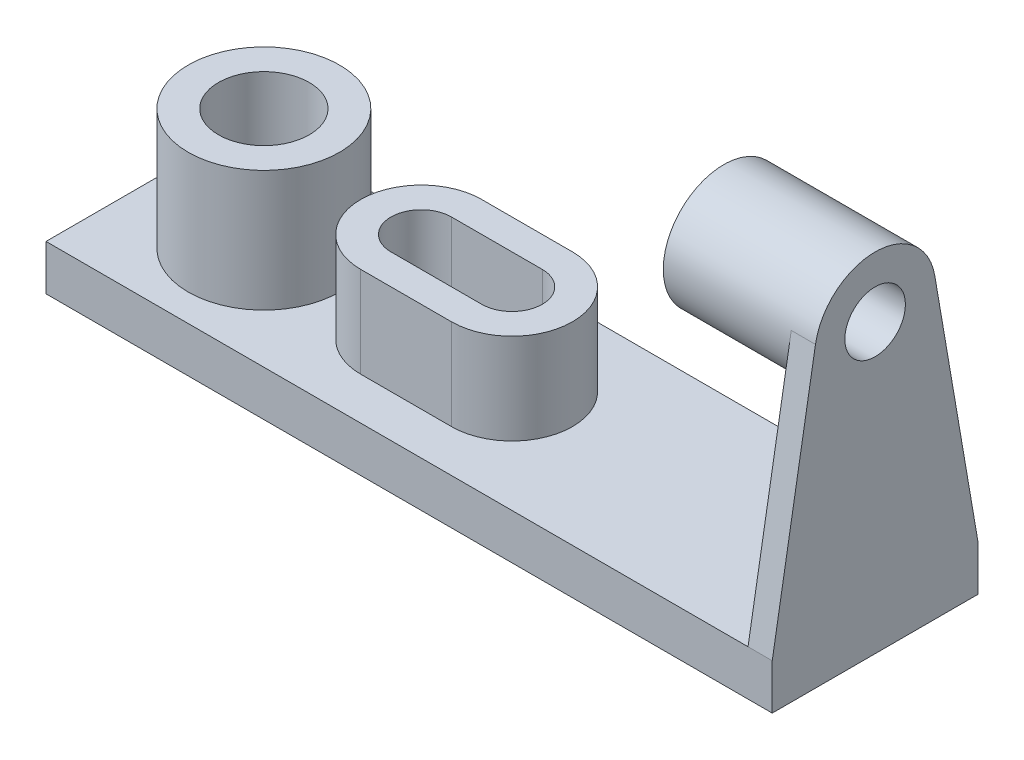
ISO-10303-21;
HEADER;
FILE_DESCRIPTION(('STEP AP214'),'2;1');
FILE_NAME('part.step','',(''),(''),'','','');
FILE_SCHEMA(('AUTOMOTIVE_DESIGN { 1 0 10303 214 1 1 1 1 }'));
ENDSEC;
DATA;
#1=APPLICATION_CONTEXT('core data for automotive mechanical design processes');
#2=APPLICATION_PROTOCOL_DEFINITION('international standard','automotive_design',2000,#1);
#3=PRODUCT_CONTEXT('',#1,'mechanical');
#4=PRODUCT('Part','Part','',(#3));
#5=PRODUCT_RELATED_PRODUCT_CATEGORY('part','',(#4));
#6=PRODUCT_DEFINITION_FORMATION('','',#4);
#7=PRODUCT_DEFINITION_CONTEXT('part definition',#1,'design');
#8=PRODUCT_DEFINITION('design','',#6,#7);
#9=PRODUCT_DEFINITION_SHAPE('','',#8);
#10=(LENGTH_UNIT() NAMED_UNIT(*) SI_UNIT(.MILLI.,.METRE.));
#11=(NAMED_UNIT(*) PLANE_ANGLE_UNIT() SI_UNIT($,.RADIAN.));
#12=(NAMED_UNIT(*) SI_UNIT($,.STERADIAN.) SOLID_ANGLE_UNIT());
#13=UNCERTAINTY_MEASURE_WITH_UNIT(LENGTH_MEASURE(1.E-05),#10,'distance_accuracy_value','');
#14=(GEOMETRIC_REPRESENTATION_CONTEXT(3) GLOBAL_UNCERTAINTY_ASSIGNED_CONTEXT((#13)) GLOBAL_UNIT_ASSIGNED_CONTEXT((#10,
#11,#12)) REPRESENTATION_CONTEXT('',''));
#15=CARTESIAN_POINT('',(0.,0.,0.));
#16=DIRECTION('',(0.,0.,1.));
#17=DIRECTION('',(1.,0.,0.));
#18=AXIS2_PLACEMENT_3D('',#15,#16,#17);
#19=CARTESIAN_POINT('',(-82.,40.,0.));
#20=DIRECTION('',(0.,-1.,0.));
#21=DIRECTION('',(0.,0.,-1.));
#22=AXIS2_PLACEMENT_3D('',#19,#20,#21);
#23=CYLINDRICAL_SURFACE('',#22,25.);
#24=CARTESIAN_POINT('',(-82.,40.,0.));
#25=DIRECTION('',(0.,1.,0.));
#26=DIRECTION('',(0.,0.,1.));
#27=AXIS2_PLACEMENT_3D('',#24,#25,#26);
#28=CIRCLE('',#27,25.);
#29=CARTESIAN_POINT('',(-82.,40.,25.));
#30=VERTEX_POINT('',#29);
#31=EDGE_CURVE('E11',#30,#30,#28,.T.);
#32=ORIENTED_EDGE('',*,*,#31,.F.);
#33=EDGE_LOOP('',(#32));
#34=FACE_BOUND('',#33,.T.);
#35=CARTESIAN_POINT('',(-82.,0.,0.));
#36=DIRECTION('',(0.,1.,0.));
#37=DIRECTION('',(0.,0.,1.));
#38=AXIS2_PLACEMENT_3D('',#35,#36,#37);
#39=CIRCLE('',#38,25.);
#40=CARTESIAN_POINT('',(-82.,0.,25.));
#41=VERTEX_POINT('',#40);
#42=EDGE_CURVE('E56',#41,#41,#39,.T.);
#43=ORIENTED_EDGE('',*,*,#42,.T.);
#44=EDGE_LOOP('',(#43));
#45=FACE_BOUND('',#44,.T.);
#46=ADVANCED_FACE('F53',(#34,#45),#23,.T.);
#47=CARTESIAN_POINT('',(-82.,40.,0.));
#48=DIRECTION('',(0.,1.,0.));
#49=DIRECTION('',(0.,0.,1.));
#50=AXIS2_PLACEMENT_3D('',#47,#48,#49);
#51=PLANE('',#50);
#52=CARTESIAN_POINT('',(-82.,40.,0.));
#53=DIRECTION('',(0.,1.,0.));
#54=DIRECTION('',(0.,0.,1.));
#55=AXIS2_PLACEMENT_3D('',#52,#53,#54);
#56=CIRCLE('',#55,15.);
#57=CARTESIAN_POINT('',(-82.,40.,15.));
#58=VERTEX_POINT('',#57);
#59=EDGE_CURVE('E63',#58,#58,#56,.F.);
#60=ORIENTED_EDGE('',*,*,#59,.T.);
#61=EDGE_LOOP('',(#60));
#62=FACE_BOUND('',#61,.T.);
#63=ORIENTED_EDGE('',*,*,#31,.T.);
#64=EDGE_LOOP('',(#63));
#65=FACE_BOUND('',#64,.T.);
#66=ADVANCED_FACE('F81',(#62,#65),#51,.T.);
#67=CARTESIAN_POINT('',(-82.,0.,0.));
#68=DIRECTION('',(0.,1.,0.));
#69=DIRECTION('',(0.,0.,1.));
#70=AXIS2_PLACEMENT_3D('',#67,#68,#69);
#71=PLANE('',#70);
#72=CARTESIAN_POINT('',(-82.,0.,0.));
#73=DIRECTION('',(0.,1.,0.));
#74=DIRECTION('',(0.,0.,1.));
#75=AXIS2_PLACEMENT_3D('',#72,#73,#74);
#76=CIRCLE('',#75,15.);
#77=CARTESIAN_POINT('',(-82.,0.,15.));
#78=VERTEX_POINT('',#77);
#79=EDGE_CURVE('E67',#78,#78,#76,.T.);
#80=ORIENTED_EDGE('',*,*,#79,.T.);
#81=EDGE_LOOP('',(#80));
#82=FACE_BOUND('',#81,.T.);
#83=ORIENTED_EDGE('',*,*,#42,.F.);
#84=EDGE_LOOP('',(#83));
#85=FACE_BOUND('',#84,.T.);
#86=ADVANCED_FACE('F71',(#82,#85),#71,.F.);
#87=CARTESIAN_POINT('',(-82.,52.,0.));
#88=DIRECTION('',(0.,-1.,0.));
#89=DIRECTION('',(0.,0.,-1.));
#90=AXIS2_PLACEMENT_3D('',#87,#88,#89);
#91=CYLINDRICAL_SURFACE('',#90,15.);
#92=ORIENTED_EDGE('',*,*,#59,.F.);
#93=EDGE_LOOP('',(#92));
#94=FACE_BOUND('',#93,.T.);
#95=ORIENTED_EDGE('',*,*,#79,.F.);
#96=EDGE_LOOP('',(#95));
#97=FACE_BOUND('',#96,.T.);
#98=ADVANCED_FACE('F74',(#94,#97),#91,.F.);
#99=CLOSED_SHELL('',(#46,#66,#86,#98));
#100=MANIFOLD_SOLID_BREP('B2',#99);
#101=CARTESIAN_POINT('',(112.,80.,0.));
#102=DIRECTION('',(1.,0.,0.));
#103=DIRECTION('',(0.,0.,-1.));
#104=AXIS2_PLACEMENT_3D('',#101,#102,#103);
#105=PLANE('',#104);
#106=CARTESIAN_POINT('',(112.,80.,0.));
#107=DIRECTION('',(-1.,0.,0.));
#108=DIRECTION('',(0.,0.,1.));
#109=AXIS2_PLACEMENT_3D('',#106,#107,#108);
#110=CIRCLE('',#109,20.);
#111=CARTESIAN_POINT('',(112.,83.2278322718956,-19.737808865842));
#112=VERTEX_POINT('',#111);
#113=CARTESIAN_POINT('',(112.,83.3778901366535,19.7126826744789));
#114=VERTEX_POINT('',#113);
#115=EDGE_CURVE('E238',#112,#114,#110,.T.);
#116=ORIENTED_EDGE('',*,*,#115,.F.);
#117=DIRECTION('',(0.,0.98563297618064,0.168901261881888));
#118=VECTOR('',#117,1.);
#119=CARTESIAN_POINT('',(112.,83.2278322718956,-19.737808865842));
#120=LINE('',#119,#118);
#121=CARTESIAN_POINT('',(112.,0.,-34.));
#122=VERTEX_POINT('',#121);
#123=EDGE_CURVE('E246',#122,#112,#120,.T.);
#124=ORIENTED_EDGE('',*,*,#123,.F.);
#125=DIRECTION('',(0.,0.,-1.));
#126=VECTOR('',#125,1.);
#127=CARTESIAN_POINT('',(112.,0.,34.));
#128=LINE('',#127,#126);
#129=CARTESIAN_POINT('',(112.,0.,34.));
#130=VERTEX_POINT('',#129);
#131=EDGE_CURVE('E241',#130,#122,#128,.T.);
#132=ORIENTED_EDGE('',*,*,#131,.F.);
#133=DIRECTION('',(0.,-0.985634133723943,0.168894506832676));
#134=VECTOR('',#133,1.);
#135=CARTESIAN_POINT('',(112.,0.,34.));
#136=LINE('',#135,#134);
#137=EDGE_CURVE('E234',#114,#130,#136,.T.);
#138=ORIENTED_EDGE('',*,*,#137,.F.);
#139=EDGE_LOOP('',(#116,#124,#132,#138));
#140=FACE_BOUND('',#139,.T.);
#141=ADVANCED_FACE('F123',(#140),#105,.F.);
#142=CARTESIAN_POINT('',(0.,0.,0.));
#143=DIRECTION('',(0.,1.,0.));
#144=DIRECTION('',(0.,0.,1.));
#145=AXIS2_PLACEMENT_3D('',#142,#143,#144);
#146=PLANE('',#145);
#147=CARTESIAN_POINT('',(-82.,0.,0.));
#148=DIRECTION('',(0.,1.,0.));
#149=DIRECTION('',(0.,0.,1.));
#150=AXIS2_PLACEMENT_3D('',#147,#148,#149);
#151=CIRCLE('',#150,25.);
#152=CARTESIAN_POINT('',(-82.,0.,25.));
#153=VERTEX_POINT('',#152);
#154=EDGE_CURVE('E375',#153,#153,#151,.T.);
#155=ORIENTED_EDGE('',*,*,#154,.F.);
#156=EDGE_LOOP('',(#155));
#157=FACE_BOUND('',#156,.T.);
#158=DIRECTION('',(1.,0.,0.));
#159=VECTOR('',#158,1.);
#160=CARTESIAN_POINT('',(-30.,0.,20.));
#161=LINE('',#160,#159);
#162=CARTESIAN_POINT('',(-30.,0.,20.));
#163=VERTEX_POINT('',#162);
#164=CARTESIAN_POINT('',(0.,0.,20.));
#165=VERTEX_POINT('',#164);
#166=EDGE_CURVE('E355',#163,#165,#161,.T.);
#167=ORIENTED_EDGE('',*,*,#166,.F.);
#168=CARTESIAN_POINT('',(-30.,0.,0.));
#169=DIRECTION('',(0.,1.,0.));
#170=DIRECTION('',(0.,0.,1.));
#171=AXIS2_PLACEMENT_3D('',#168,#169,#170);
#172=CIRCLE('',#171,20.);
#173=CARTESIAN_POINT('',(-30.,0.,-20.));
#174=VERTEX_POINT('',#173);
#175=EDGE_CURVE('E336',#174,#163,#172,.T.);
#176=ORIENTED_EDGE('',*,*,#175,.F.);
#177=DIRECTION('',(-1.,0.,0.));
#178=VECTOR('',#177,1.);
#179=CARTESIAN_POINT('',(-30.,0.,-20.));
#180=LINE('',#179,#178);
#181=CARTESIAN_POINT('',(0.,0.,-20.));
#182=VERTEX_POINT('',#181);
#183=EDGE_CURVE('E342',#182,#174,#180,.T.);
#184=ORIENTED_EDGE('',*,*,#183,.F.);
#185=CARTESIAN_POINT('',(0.,0.,0.));
#186=DIRECTION('',(0.,1.,0.));
#187=DIRECTION('',(0.,0.,1.));
#188=AXIS2_PLACEMENT_3D('',#185,#186,#187);
#189=CIRCLE('',#188,20.);
#190=EDGE_CURVE('E358',#165,#182,#189,.T.);
#191=ORIENTED_EDGE('',*,*,#190,.F.);
#192=EDGE_LOOP('',(#167,#176,#184,#191));
#193=FACE_BOUND('',#192,.T.);
#194=DIRECTION('',(1.,0.,0.));
#195=VECTOR('',#194,1.);
#196=CARTESIAN_POINT('',(0.,0.,34.));
#197=LINE('',#196,#195);
#198=CARTESIAN_POINT('',(-120.,0.,34.));
#199=VERTEX_POINT('',#198);
#200=EDGE_CURVE('E381',#199,#130,#197,.T.);
#201=ORIENTED_EDGE('',*,*,#200,.T.);
#202=ORIENTED_EDGE('',*,*,#131,.T.);
#203=DIRECTION('',(1.,0.,0.));
#204=VECTOR('',#203,1.);
#205=CARTESIAN_POINT('',(0.,0.,-34.));
#206=LINE('',#205,#204);
#207=CARTESIAN_POINT('',(-120.,0.,-34.));
#208=VERTEX_POINT('',#207);
#209=EDGE_CURVE('E398',#208,#122,#206,.T.);
#210=ORIENTED_EDGE('',*,*,#209,.F.);
#211=DIRECTION('',(0.,0.,1.));
#212=VECTOR('',#211,1.);
#213=CARTESIAN_POINT('',(-120.,0.,0.));
#214=LINE('',#213,#212);
#215=EDGE_CURVE('E402',#208,#199,#214,.T.);
#216=ORIENTED_EDGE('',*,*,#215,.T.);
#217=EDGE_LOOP('',(#201,#202,#210,#216));
#218=FACE_BOUND('',#217,.T.);
#219=ADVANCED_FACE('F428',(#157,#193,#218),#146,.T.);
#220=CARTESIAN_POINT('',(0.,-15.,0.));
#221=DIRECTION('',(0.,1.,0.));
#222=DIRECTION('',(0.,0.,1.));
#223=AXIS2_PLACEMENT_3D('',#220,#221,#222);
#224=PLANE('',#223);
#225=DIRECTION('',(0.,0.,1.));
#226=VECTOR('',#225,1.);
#227=CARTESIAN_POINT('',(120.,-15.,0.));
#228=LINE('',#227,#226);
#229=CARTESIAN_POINT('',(120.,-15.,-34.));
#230=VERTEX_POINT('',#229);
#231=CARTESIAN_POINT('',(120.,-15.,34.));
#232=VERTEX_POINT('',#231);
#233=EDGE_CURVE('E380',#230,#232,#228,.T.);
#234=ORIENTED_EDGE('',*,*,#233,.T.);
#235=DIRECTION('',(1.,0.,0.));
#236=VECTOR('',#235,1.);
#237=CARTESIAN_POINT('',(0.,-15.,34.));
#238=LINE('',#237,#236);
#239=CARTESIAN_POINT('',(-120.,-15.,34.));
#240=VERTEX_POINT('',#239);
#241=EDGE_CURVE('E391',#240,#232,#238,.T.);
#242=ORIENTED_EDGE('',*,*,#241,.F.);
#243=DIRECTION('',(0.,0.,1.));
#244=VECTOR('',#243,1.);
#245=CARTESIAN_POINT('',(-120.,-15.,0.));
#246=LINE('',#245,#244);
#247=CARTESIAN_POINT('',(-120.,-15.,-34.));
#248=VERTEX_POINT('',#247);
#249=EDGE_CURVE('E387',#248,#240,#246,.T.);
#250=ORIENTED_EDGE('',*,*,#249,.F.);
#251=DIRECTION('',(1.,0.,0.));
#252=VECTOR('',#251,1.);
#253=CARTESIAN_POINT('',(0.,-15.,-34.));
#254=LINE('',#253,#252);
#255=EDGE_CURVE('E384',#248,#230,#254,.T.);
#256=ORIENTED_EDGE('',*,*,#255,.T.);
#257=EDGE_LOOP('',(#234,#242,#250,#256));
#258=FACE_BOUND('',#257,.T.);
#259=CARTESIAN_POINT('',(-82.,-15.,0.));
#260=DIRECTION('',(0.,1.,0.));
#261=DIRECTION('',(0.,0.,1.));
#262=AXIS2_PLACEMENT_3D('',#259,#260,#261);
#263=CIRCLE('',#262,25.);
#264=CARTESIAN_POINT('',(-82.,-15.,25.));
#265=VERTEX_POINT('',#264);
#266=EDGE_CURVE('E376',#265,#265,#263,.T.);
#267=ORIENTED_EDGE('',*,*,#266,.T.);
#268=EDGE_LOOP('',(#267));
#269=FACE_BOUND('',#268,.T.);
#270=CARTESIAN_POINT('',(-30.,-15.,0.));
#271=DIRECTION('',(0.,1.,0.));
#272=DIRECTION('',(0.,0.,1.));
#273=AXIS2_PLACEMENT_3D('',#270,#271,#272);
#274=CIRCLE('',#273,10.);
#275=CARTESIAN_POINT('',(-30.,-15.,10.));
#276=VERTEX_POINT('',#275);
#277=CARTESIAN_POINT('',(-30.,-15.,-10.));
#278=VERTEX_POINT('',#277);
#279=EDGE_CURVE('E309',#276,#278,#274,.F.);
#280=ORIENTED_EDGE('',*,*,#279,.F.);
#281=DIRECTION('',(-1.,0.,0.));
#282=VECTOR('',#281,1.);
#283=CARTESIAN_POINT('',(0.,-15.,10.));
#284=LINE('',#283,#282);
#285=CARTESIAN_POINT('',(0.,-15.,10.));
#286=VERTEX_POINT('',#285);
#287=EDGE_CURVE('E305',#286,#276,#284,.T.);
#288=ORIENTED_EDGE('',*,*,#287,.F.);
#289=CARTESIAN_POINT('',(0.,-15.,0.));
#290=DIRECTION('',(0.,1.,0.));
#291=DIRECTION('',(0.,0.,1.));
#292=AXIS2_PLACEMENT_3D('',#289,#290,#291);
#293=CIRCLE('',#292,10.);
#294=CARTESIAN_POINT('',(0.,-15.,-10.));
#295=VERTEX_POINT('',#294);
#296=EDGE_CURVE('E301',#295,#286,#293,.F.);
#297=ORIENTED_EDGE('',*,*,#296,.F.);
#298=DIRECTION('',(1.,0.,0.));
#299=VECTOR('',#298,1.);
#300=CARTESIAN_POINT('',(0.,-15.,-10.));
#301=LINE('',#300,#299);
#302=EDGE_CURVE('E292',#278,#295,#301,.T.);
#303=ORIENTED_EDGE('',*,*,#302,.F.);
#304=EDGE_LOOP('',(#280,#288,#297,#303));
#305=FACE_BOUND('',#304,.T.);
#306=ADVANCED_FACE('F435',(#258,#269,#305),#224,.F.);
#307=CARTESIAN_POINT('',(120.,-15.,0.));
#308=DIRECTION('',(-1.,0.,0.));
#309=DIRECTION('',(0.,0.,1.));
#310=AXIS2_PLACEMENT_3D('',#307,#308,#309);
#311=PLANE('',#310);
#312=DIRECTION('',(0.,1.,0.));
#313=VECTOR('',#312,1.);
#314=CARTESIAN_POINT('',(120.,-15.,-34.));
#315=LINE('',#314,#313);
#316=CARTESIAN_POINT('',(120.,0.,-34.));
#317=VERTEX_POINT('',#316);
#318=EDGE_CURVE('E127',#230,#317,#315,.T.);
#319=ORIENTED_EDGE('',*,*,#318,.T.);
#320=DIRECTION('',(0.,0.98563297618064,0.168901261881888));
#321=VECTOR('',#320,1.);
#322=CARTESIAN_POINT('',(120.,83.2278322718956,-19.737808865842));
#323=LINE('',#322,#321);
#324=CARTESIAN_POINT('',(120.,83.2278322718956,-19.737808865842));
#325=VERTEX_POINT('',#324);
#326=EDGE_CURVE('E278',#317,#325,#323,.T.);
#327=ORIENTED_EDGE('',*,*,#326,.T.);
#328=CARTESIAN_POINT('',(120.,80.,0.));
#329=DIRECTION('',(1.,0.,0.));
#330=DIRECTION('',(0.,0.,-1.));
#331=AXIS2_PLACEMENT_3D('',#328,#329,#330);
#332=CIRCLE('',#331,20.);
#333=CARTESIAN_POINT('',(120.,83.3778901366535,19.7126826744789));
#334=VERTEX_POINT('',#333);
#335=EDGE_CURVE('E286',#325,#334,#332,.T.);
#336=ORIENTED_EDGE('',*,*,#335,.T.);
#337=DIRECTION('',(0.,-0.985634133723943,0.168894506832676));
#338=VECTOR('',#337,1.);
#339=CARTESIAN_POINT('',(120.,0.,34.));
#340=LINE('',#339,#338);
#341=CARTESIAN_POINT('',(120.,0.,34.));
#342=VERTEX_POINT('',#341);
#343=EDGE_CURVE('E252',#334,#342,#340,.T.);
#344=ORIENTED_EDGE('',*,*,#343,.T.);
#345=DIRECTION('',(0.,1.,0.));
#346=VECTOR('',#345,1.);
#347=CARTESIAN_POINT('',(120.,-15.,34.));
#348=LINE('',#347,#346);
#349=EDGE_CURVE('E51',#232,#342,#348,.T.);
#350=ORIENTED_EDGE('',*,*,#349,.F.);
#351=ORIENTED_EDGE('',*,*,#233,.F.);
#352=EDGE_LOOP('',(#319,#327,#336,#344,#350,#351));
#353=FACE_BOUND('',#352,.T.);
#354=CARTESIAN_POINT('',(120.,80.,0.));
#355=DIRECTION('',(1.,0.,0.));
#356=DIRECTION('',(0.,0.,-1.));
#357=AXIS2_PLACEMENT_3D('',#354,#355,#356);
#358=CIRCLE('',#357,10.);
#359=CARTESIAN_POINT('',(120.,80.,-10.));
#360=VERTEX_POINT('',#359);
#361=EDGE_CURVE('E270',#360,#360,#358,.T.);
#362=ORIENTED_EDGE('',*,*,#361,.F.);
#363=EDGE_LOOP('',(#362));
#364=FACE_BOUND('',#363,.T.);
#365=ADVANCED_FACE('F420',(#353,#364),#311,.F.);
#366=CARTESIAN_POINT('',(0.,-15.,34.));
#367=DIRECTION('',(0.,0.,1.));
#368=DIRECTION('',(1.,0.,0.));
#369=AXIS2_PLACEMENT_3D('',#366,#367,#368);
#370=PLANE('',#369);
#371=ORIENTED_EDGE('',*,*,#200,.F.);
#372=DIRECTION('',(0.,1.,0.));
#373=VECTOR('',#372,1.);
#374=CARTESIAN_POINT('',(-120.,-15.,34.));
#375=LINE('',#374,#373);
#376=EDGE_CURVE('E133',#240,#199,#375,.T.);
#377=ORIENTED_EDGE('',*,*,#376,.F.);
#378=ORIENTED_EDGE('',*,*,#241,.T.);
#379=ORIENTED_EDGE('',*,*,#349,.T.);
#380=DIRECTION('',(1.,0.,0.));
#381=VECTOR('',#380,1.);
#382=CARTESIAN_POINT('',(112.,0.,34.));
#383=LINE('',#382,#381);
#384=EDGE_CURVE('E257',#130,#342,#383,.T.);
#385=ORIENTED_EDGE('',*,*,#384,.F.);
#386=EDGE_LOOP('',(#371,#377,#378,#379,#385));
#387=FACE_BOUND('',#386,.T.);
#388=ADVANCED_FACE('F432',(#387),#370,.T.);
#389=CARTESIAN_POINT('',(-120.,-15.,0.));
#390=DIRECTION('',(-1.,0.,0.));
#391=DIRECTION('',(0.,0.,1.));
#392=AXIS2_PLACEMENT_3D('',#389,#390,#391);
#393=PLANE('',#392);
#394=ORIENTED_EDGE('',*,*,#215,.F.);
#395=DIRECTION('',(0.,1.,0.));
#396=VECTOR('',#395,1.);
#397=CARTESIAN_POINT('',(-120.,-15.,-34.));
#398=LINE('',#397,#396);
#399=EDGE_CURVE('E410',#248,#208,#398,.T.);
#400=ORIENTED_EDGE('',*,*,#399,.F.);
#401=ORIENTED_EDGE('',*,*,#249,.T.);
#402=ORIENTED_EDGE('',*,*,#376,.T.);
#403=EDGE_LOOP('',(#394,#400,#401,#402));
#404=FACE_BOUND('',#403,.T.);
#405=ADVANCED_FACE('F438',(#404),#393,.T.);
#406=CARTESIAN_POINT('',(-82.,-15.,0.));
#407=DIRECTION('',(0.,1.,0.));
#408=DIRECTION('',(0.,0.,1.));
#409=AXIS2_PLACEMENT_3D('',#406,#407,#408);
#410=CYLINDRICAL_SURFACE('',#409,25.);
#411=ORIENTED_EDGE('',*,*,#266,.F.);
#412=EDGE_LOOP('',(#411));
#413=FACE_BOUND('',#412,.T.);
#414=ORIENTED_EDGE('',*,*,#154,.T.);
#415=EDGE_LOOP('',(#414));
#416=FACE_BOUND('',#415,.T.);
#417=ADVANCED_FACE('F125',(#413,#416),#410,.F.);
#418=CARTESIAN_POINT('',(0.,-15.,-34.));
#419=DIRECTION('',(0.,0.,1.));
#420=DIRECTION('',(1.,0.,0.));
#421=AXIS2_PLACEMENT_3D('',#418,#419,#420);
#422=PLANE('',#421);
#423=ORIENTED_EDGE('',*,*,#209,.T.);
#424=DIRECTION('',(1.,0.,0.));
#425=VECTOR('',#424,1.);
#426=CARTESIAN_POINT('',(112.,0.,-34.));
#427=LINE('',#426,#425);
#428=EDGE_CURVE('E245',#122,#317,#427,.T.);
#429=ORIENTED_EDGE('',*,*,#428,.T.);
#430=ORIENTED_EDGE('',*,*,#318,.F.);
#431=ORIENTED_EDGE('',*,*,#255,.F.);
#432=ORIENTED_EDGE('',*,*,#399,.T.);
#433=EDGE_LOOP('',(#423,#429,#430,#431,#432));
#434=FACE_BOUND('',#433,.T.);
#435=ADVANCED_FACE('F423',(#434),#422,.F.);
#436=CARTESIAN_POINT('',(-30.,30.,0.));
#437=DIRECTION('',(0.,1.,0.));
#438=DIRECTION('',(0.,0.,1.));
#439=AXIS2_PLACEMENT_3D('',#436,#437,#438);
#440=PLANE('',#439);
#441=CARTESIAN_POINT('',(-30.,30.,0.));
#442=DIRECTION('',(0.,1.,0.));
#443=DIRECTION('',(0.,0.,1.));
#444=AXIS2_PLACEMENT_3D('',#441,#442,#443);
#445=CIRCLE('',#444,20.);
#446=CARTESIAN_POINT('',(-30.,30.,-20.));
#447=VERTEX_POINT('',#446);
#448=CARTESIAN_POINT('',(-30.,30.,20.));
#449=VERTEX_POINT('',#448);
#450=EDGE_CURVE('E337',#447,#449,#445,.T.);
#451=ORIENTED_EDGE('',*,*,#450,.T.);
#452=DIRECTION('',(1.,0.,0.));
#453=VECTOR('',#452,1.);
#454=CARTESIAN_POINT('',(-30.,30.,20.));
#455=LINE('',#454,#453);
#456=CARTESIAN_POINT('',(0.,30.,20.));
#457=VERTEX_POINT('',#456);
#458=EDGE_CURVE('E341',#449,#457,#455,.T.);
#459=ORIENTED_EDGE('',*,*,#458,.T.);
#460=CARTESIAN_POINT('',(0.,30.,0.));
#461=DIRECTION('',(0.,1.,0.));
#462=DIRECTION('',(0.,0.,1.));
#463=AXIS2_PLACEMENT_3D('',#460,#461,#462);
#464=CIRCLE('',#463,20.);
#465=CARTESIAN_POINT('',(0.,30.,-20.));
#466=VERTEX_POINT('',#465);
#467=EDGE_CURVE('E345',#457,#466,#464,.T.);
#468=ORIENTED_EDGE('',*,*,#467,.T.);
#469=DIRECTION('',(-1.,0.,0.));
#470=VECTOR('',#469,1.);
#471=CARTESIAN_POINT('',(-30.,30.,-20.));
#472=LINE('',#471,#470);
#473=EDGE_CURVE('E348',#466,#447,#472,.T.);
#474=ORIENTED_EDGE('',*,*,#473,.T.);
#475=EDGE_LOOP('',(#451,#459,#468,#474));
#476=FACE_BOUND('',#475,.T.);
#477=DIRECTION('',(1.,0.,0.));
#478=VECTOR('',#477,1.);
#479=CARTESIAN_POINT('',(-30.,30.,10.));
#480=LINE('',#479,#478);
#481=CARTESIAN_POINT('',(-30.,30.,10.));
#482=VERTEX_POINT('',#481);
#483=CARTESIAN_POINT('',(0.,30.,10.));
#484=VERTEX_POINT('',#483);
#485=EDGE_CURVE('E315',#482,#484,#480,.T.);
#486=ORIENTED_EDGE('',*,*,#485,.F.);
#487=CARTESIAN_POINT('',(-30.,30.,0.));
#488=DIRECTION('',(0.,1.,0.));
#489=DIRECTION('',(0.,0.,1.));
#490=AXIS2_PLACEMENT_3D('',#487,#488,#489);
#491=CIRCLE('',#490,10.);
#492=CARTESIAN_POINT('',(-30.,30.,-10.));
#493=VERTEX_POINT('',#492);
#494=EDGE_CURVE('E312',#493,#482,#491,.T.);
#495=ORIENTED_EDGE('',*,*,#494,.F.);
#496=DIRECTION('',(-1.,0.,0.));
#497=VECTOR('',#496,1.);
#498=CARTESIAN_POINT('',(-30.,30.,-10.));
#499=LINE('',#498,#497);
#500=CARTESIAN_POINT('',(0.,30.,-10.));
#501=VERTEX_POINT('',#500);
#502=EDGE_CURVE('E322',#501,#493,#499,.T.);
#503=ORIENTED_EDGE('',*,*,#502,.F.);
#504=CARTESIAN_POINT('',(0.,30.,0.));
#505=DIRECTION('',(0.,1.,0.));
#506=DIRECTION('',(0.,0.,1.));
#507=AXIS2_PLACEMENT_3D('',#504,#505,#506);
#508=CIRCLE('',#507,10.);
#509=EDGE_CURVE('E318',#484,#501,#508,.T.);
#510=ORIENTED_EDGE('',*,*,#509,.F.);
#511=EDGE_LOOP('',(#486,#495,#503,#510));
#512=FACE_BOUND('',#511,.T.);
#513=ADVANCED_FACE('F481',(#476,#512),#440,.T.);
#514=CARTESIAN_POINT('',(-30.,30.,0.));
#515=DIRECTION('',(0.,-1.,0.));
#516=DIRECTION('',(0.,0.,-1.));
#517=AXIS2_PLACEMENT_3D('',#514,#515,#516);
#518=CYLINDRICAL_SURFACE('',#517,20.);
#519=ORIENTED_EDGE('',*,*,#175,.T.);
#520=DIRECTION('',(0.,-1.,0.));
#521=VECTOR('',#520,1.);
#522=CARTESIAN_POINT('',(-30.,30.,20.));
#523=LINE('',#522,#521);
#524=EDGE_CURVE('E372',#449,#163,#523,.T.);
#525=ORIENTED_EDGE('',*,*,#524,.F.);
#526=ORIENTED_EDGE('',*,*,#450,.F.);
#527=DIRECTION('',(0.,-1.,0.));
#528=VECTOR('',#527,1.);
#529=CARTESIAN_POINT('',(-30.,30.,-20.));
#530=LINE('',#529,#528);
#531=EDGE_CURVE('E351',#447,#174,#530,.T.);
#532=ORIENTED_EDGE('',*,*,#531,.T.);
#533=EDGE_LOOP('',(#519,#525,#526,#532));
#534=FACE_BOUND('',#533,.T.);
#535=ADVANCED_FACE('F484',(#534),#518,.T.);
#536=CARTESIAN_POINT('',(-30.,30.,20.));
#537=DIRECTION('',(0.,0.,-1.));
#538=DIRECTION('',(-1.,0.,0.));
#539=AXIS2_PLACEMENT_3D('',#536,#537,#538);
#540=PLANE('',#539);
#541=ORIENTED_EDGE('',*,*,#166,.T.);
#542=DIRECTION('',(0.,-1.,0.));
#543=VECTOR('',#542,1.);
#544=CARTESIAN_POINT('',(0.,30.,20.));
#545=LINE('',#544,#543);
#546=EDGE_CURVE('E368',#457,#165,#545,.T.);
#547=ORIENTED_EDGE('',*,*,#546,.F.);
#548=ORIENTED_EDGE('',*,*,#458,.F.);
#549=ORIENTED_EDGE('',*,*,#524,.T.);
#550=EDGE_LOOP('',(#541,#547,#548,#549));
#551=FACE_BOUND('',#550,.T.);
#552=ADVANCED_FACE('F491',(#551),#540,.F.);
#553=CARTESIAN_POINT('',(0.,30.,0.));
#554=DIRECTION('',(0.,-1.,0.));
#555=DIRECTION('',(0.,0.,-1.));
#556=AXIS2_PLACEMENT_3D('',#553,#554,#555);
#557=CYLINDRICAL_SURFACE('',#556,20.);
#558=ORIENTED_EDGE('',*,*,#190,.T.);
#559=DIRECTION('',(0.,-1.,0.));
#560=VECTOR('',#559,1.);
#561=CARTESIAN_POINT('',(0.,30.,-20.));
#562=LINE('',#561,#560);
#563=EDGE_CURVE('E149',#466,#182,#562,.T.);
#564=ORIENTED_EDGE('',*,*,#563,.F.);
#565=ORIENTED_EDGE('',*,*,#467,.F.);
#566=ORIENTED_EDGE('',*,*,#546,.T.);
#567=EDGE_LOOP('',(#558,#564,#565,#566));
#568=FACE_BOUND('',#567,.T.);
#569=ADVANCED_FACE('F488',(#568),#557,.T.);
#570=CARTESIAN_POINT('',(-30.,30.,-20.));
#571=DIRECTION('',(0.,0.,1.));
#572=DIRECTION('',(1.,0.,0.));
#573=AXIS2_PLACEMENT_3D('',#570,#571,#572);
#574=PLANE('',#573);
#575=ORIENTED_EDGE('',*,*,#183,.T.);
#576=ORIENTED_EDGE('',*,*,#531,.F.);
#577=ORIENTED_EDGE('',*,*,#473,.F.);
#578=ORIENTED_EDGE('',*,*,#563,.T.);
#579=EDGE_LOOP('',(#575,#576,#577,#578));
#580=FACE_BOUND('',#579,.T.);
#581=ADVANCED_FACE('F479',(#580),#574,.F.);
#582=CARTESIAN_POINT('',(-30.,30.,0.));
#583=DIRECTION('',(0.,-1.,0.));
#584=DIRECTION('',(0.,0.,-1.));
#585=AXIS2_PLACEMENT_3D('',#582,#583,#584);
#586=CYLINDRICAL_SURFACE('',#585,10.);
#587=DIRECTION('',(0.,-1.,0.));
#588=VECTOR('',#587,1.);
#589=CARTESIAN_POINT('',(-30.,30.,10.));
#590=LINE('',#589,#588);
#591=EDGE_CURVE('E333',#482,#276,#590,.T.);
#592=ORIENTED_EDGE('',*,*,#591,.T.);
#593=ORIENTED_EDGE('',*,*,#279,.T.);
#594=DIRECTION('',(0.,-1.,0.));
#595=VECTOR('',#594,1.);
#596=CARTESIAN_POINT('',(-30.,30.,-10.));
#597=LINE('',#596,#595);
#598=EDGE_CURVE('E141',#493,#278,#597,.T.);
#599=ORIENTED_EDGE('',*,*,#598,.F.);
#600=ORIENTED_EDGE('',*,*,#494,.T.);
#601=EDGE_LOOP('',(#592,#593,#599,#600));
#602=FACE_BOUND('',#601,.T.);
#603=ADVANCED_FACE('F475',(#602),#586,.F.);
#604=CARTESIAN_POINT('',(-30.,30.,10.));
#605=DIRECTION('',(0.,0.,-1.));
#606=DIRECTION('',(-1.,0.,0.));
#607=AXIS2_PLACEMENT_3D('',#604,#605,#606);
#608=PLANE('',#607);
#609=DIRECTION('',(0.,-1.,0.));
#610=VECTOR('',#609,1.);
#611=CARTESIAN_POINT('',(0.,30.,10.));
#612=LINE('',#611,#610);
#613=EDGE_CURVE('E330',#484,#286,#612,.T.);
#614=ORIENTED_EDGE('',*,*,#613,.T.);
#615=ORIENTED_EDGE('',*,*,#287,.T.);
#616=ORIENTED_EDGE('',*,*,#591,.F.);
#617=ORIENTED_EDGE('',*,*,#485,.T.);
#618=EDGE_LOOP('',(#614,#615,#616,#617));
#619=FACE_BOUND('',#618,.T.);
#620=ADVANCED_FACE('F471',(#619),#608,.T.);
#621=CARTESIAN_POINT('',(0.,30.,0.));
#622=DIRECTION('',(0.,-1.,0.));
#623=DIRECTION('',(0.,0.,-1.));
#624=AXIS2_PLACEMENT_3D('',#621,#622,#623);
#625=CYLINDRICAL_SURFACE('',#624,10.);
#626=DIRECTION('',(0.,-1.,0.));
#627=VECTOR('',#626,1.);
#628=CARTESIAN_POINT('',(0.,30.,-10.));
#629=LINE('',#628,#627);
#630=EDGE_CURVE('E327',#501,#295,#629,.T.);
#631=ORIENTED_EDGE('',*,*,#630,.T.);
#632=ORIENTED_EDGE('',*,*,#296,.T.);
#633=ORIENTED_EDGE('',*,*,#613,.F.);
#634=ORIENTED_EDGE('',*,*,#509,.T.);
#635=EDGE_LOOP('',(#631,#632,#633,#634));
#636=FACE_BOUND('',#635,.T.);
#637=ADVANCED_FACE('F468',(#636),#625,.F.);
#638=CARTESIAN_POINT('',(-30.,30.,-10.));
#639=DIRECTION('',(0.,0.,1.));
#640=DIRECTION('',(1.,0.,0.));
#641=AXIS2_PLACEMENT_3D('',#638,#639,#640);
#642=PLANE('',#641);
#643=ORIENTED_EDGE('',*,*,#598,.T.);
#644=ORIENTED_EDGE('',*,*,#302,.T.);
#645=ORIENTED_EDGE('',*,*,#630,.F.);
#646=ORIENTED_EDGE('',*,*,#502,.T.);
#647=EDGE_LOOP('',(#643,#644,#645,#646));
#648=FACE_BOUND('',#647,.T.);
#649=ADVANCED_FACE('F461',(#648),#642,.T.);
#650=CARTESIAN_POINT('',(112.,0.,34.));
#651=DIRECTION('',(0.,0.168894506832676,0.985634133723943));
#652=DIRECTION('',(0.,-0.985634133723943,0.168894506832676));
#653=AXIS2_PLACEMENT_3D('',#650,#651,#652);
#654=PLANE('',#653);
#655=ORIENTED_EDGE('',*,*,#343,.F.);
#656=DIRECTION('',(1.,0.,0.));
#657=VECTOR('',#656,1.);
#658=CARTESIAN_POINT('',(112.,83.3778901366535,19.7126826744789));
#659=LINE('',#658,#657);
#660=EDGE_CURVE('E249',#114,#334,#659,.T.);
#661=ORIENTED_EDGE('',*,*,#660,.F.);
#662=ORIENTED_EDGE('',*,*,#137,.T.);
#663=ORIENTED_EDGE('',*,*,#384,.T.);
#664=EDGE_LOOP('',(#655,#661,#662,#663));
#665=FACE_BOUND('',#664,.T.);
#666=ADVANCED_FACE('F250',(#665),#654,.T.);
#667=CARTESIAN_POINT('',(112.,80.,0.));
#668=DIRECTION('',(1.,0.,0.));
#669=DIRECTION('',(0.,0.,-1.));
#670=AXIS2_PLACEMENT_3D('',#667,#668,#669);
#671=CYLINDRICAL_SURFACE('',#670,20.);
#672=ORIENTED_EDGE('',*,*,#335,.F.);
#673=DIRECTION('',(1.,0.,0.));
#674=VECTOR('',#673,1.);
#675=CARTESIAN_POINT('',(112.,83.2278322718956,-19.737808865842));
#676=LINE('',#675,#674);
#677=EDGE_CURVE('E258',#112,#325,#676,.T.);
#678=ORIENTED_EDGE('',*,*,#677,.F.);
#679=ORIENTED_EDGE('',*,*,#115,.T.);
#680=ORIENTED_EDGE('',*,*,#660,.T.);
#681=EDGE_LOOP('',(#672,#678,#679,#680));
#682=FACE_BOUND('',#681,.T.);
#683=CARTESIAN_POINT('',(70.,80.,0.));
#684=DIRECTION('',(-1.,0.,0.));
#685=DIRECTION('',(0.,0.,1.));
#686=AXIS2_PLACEMENT_3D('',#683,#684,#685);
#687=CIRCLE('',#686,20.);
#688=CARTESIAN_POINT('',(70.,80.,20.));
#689=VERTEX_POINT('',#688);
#690=EDGE_CURVE('E264',#689,#689,#687,.T.);
#691=ORIENTED_EDGE('',*,*,#690,.F.);
#692=EDGE_LOOP('',(#691));
#693=FACE_BOUND('',#692,.T.);
#694=ADVANCED_FACE('F260',(#682,#693),#671,.T.);
#695=CARTESIAN_POINT('',(112.,83.2278322718956,-19.737808865842));
#696=DIRECTION('',(0.,0.168901261881889,-0.98563297618064));
#697=DIRECTION('',(0.,0.98563297618064,0.168901261881889));
#698=AXIS2_PLACEMENT_3D('',#695,#696,#697);
#699=PLANE('',#698);
#700=ORIENTED_EDGE('',*,*,#326,.F.);
#701=ORIENTED_EDGE('',*,*,#428,.F.);
#702=ORIENTED_EDGE('',*,*,#123,.T.);
#703=ORIENTED_EDGE('',*,*,#677,.T.);
#704=EDGE_LOOP('',(#700,#701,#702,#703));
#705=FACE_BOUND('',#704,.T.);
#706=ADVANCED_FACE('F426',(#705),#699,.T.);
#707=CARTESIAN_POINT('',(112.,80.,0.));
#708=DIRECTION('',(1.,0.,0.));
#709=DIRECTION('',(0.,0.,-1.));
#710=AXIS2_PLACEMENT_3D('',#707,#708,#709);
#711=CYLINDRICAL_SURFACE('',#710,10.);
#712=ORIENTED_EDGE('',*,*,#361,.T.);
#713=EDGE_LOOP('',(#712));
#714=FACE_BOUND('',#713,.T.);
#715=CARTESIAN_POINT('',(70.,80.,0.));
#716=DIRECTION('',(-1.,0.,0.));
#717=DIRECTION('',(0.,0.,1.));
#718=AXIS2_PLACEMENT_3D('',#715,#716,#717);
#719=CIRCLE('',#718,10.);
#720=CARTESIAN_POINT('',(70.,80.,10.));
#721=VERTEX_POINT('',#720);
#722=EDGE_CURVE('E265',#721,#721,#719,.T.);
#723=ORIENTED_EDGE('',*,*,#722,.T.);
#724=EDGE_LOOP('',(#723));
#725=FACE_BOUND('',#724,.T.);
#726=ADVANCED_FACE('F457',(#714,#725),#711,.F.);
#727=CARTESIAN_POINT('',(70.,80.,0.));
#728=DIRECTION('',(-1.,0.,0.));
#729=DIRECTION('',(0.,0.,1.));
#730=AXIS2_PLACEMENT_3D('',#727,#728,#729);
#731=PLANE('',#730);
#732=ORIENTED_EDGE('',*,*,#690,.T.);
#733=EDGE_LOOP('',(#732));
#734=FACE_BOUND('',#733,.T.);
#735=ORIENTED_EDGE('',*,*,#722,.F.);
#736=EDGE_LOOP('',(#735));
#737=FACE_BOUND('',#736,.T.);
#738=ADVANCED_FACE('F566',(#734,#737),#731,.T.);
#739=CLOSED_SHELL('',(#141,#219,#306,#365,#388,#405,#417,#435,#513,#535,#552,#569,#581,#603,
#620,#637,#649,#666,#694,#706,#726,#738));
#740=MANIFOLD_SOLID_BREP('B6',#739);
#741=ADVANCED_BREP_SHAPE_REPRESENTATION('',(#18,#100,#740),#14);
#742=SHAPE_DEFINITION_REPRESENTATION(#9,#741);
ENDSEC;
END-ISO-10303-21;
